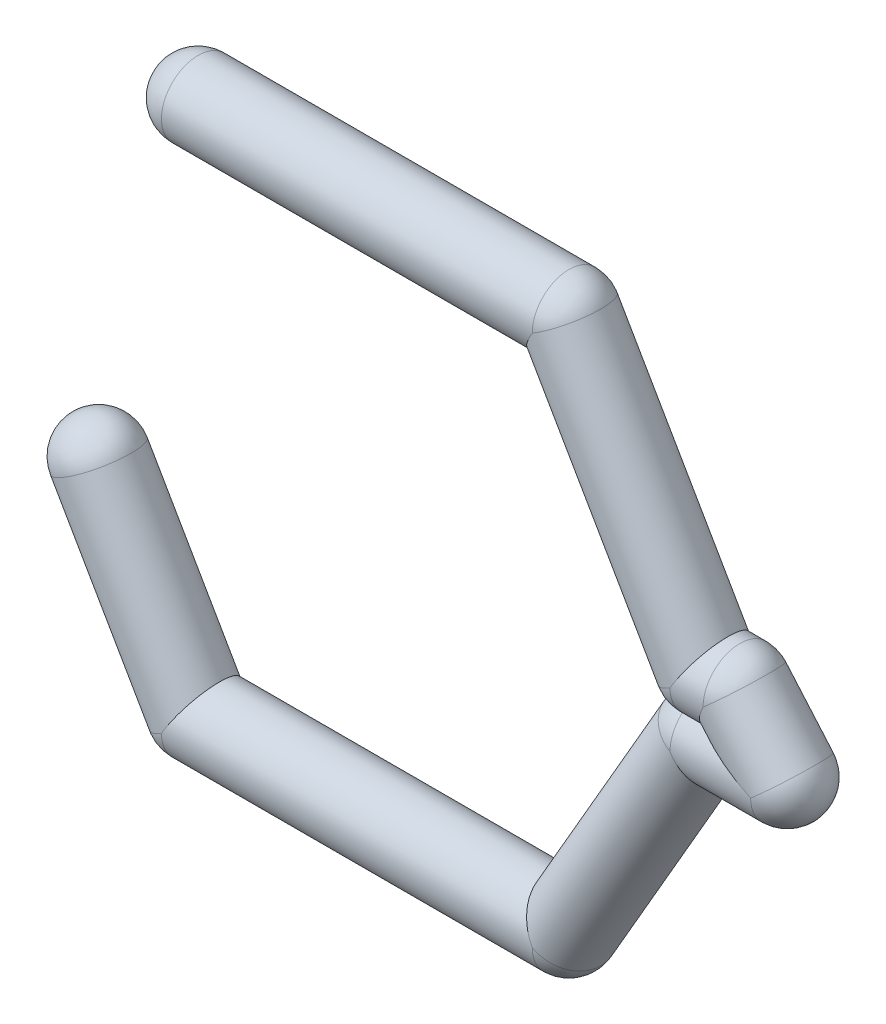
ISO-10303-21;
HEADER;
FILE_DESCRIPTION(('STEP AP214'),'2;1');
FILE_NAME('part.step','',(''),(''),'','','');
FILE_SCHEMA(('AUTOMOTIVE_DESIGN { 1 0 10303 214 1 1 1 1 }'));
ENDSEC;
DATA;
#1=APPLICATION_CONTEXT('core data for automotive mechanical design processes');
#2=APPLICATION_PROTOCOL_DEFINITION('international standard','automotive_design',2000,#1);
#3=PRODUCT_CONTEXT('',#1,'mechanical');
#4=PRODUCT('Part','Part','',(#3));
#5=PRODUCT_RELATED_PRODUCT_CATEGORY('part','',(#4));
#6=PRODUCT_DEFINITION_FORMATION('','',#4);
#7=PRODUCT_DEFINITION_CONTEXT('part definition',#1,'design');
#8=PRODUCT_DEFINITION('design','',#6,#7);
#9=PRODUCT_DEFINITION_SHAPE('','',#8);
#10=(LENGTH_UNIT() NAMED_UNIT(*) SI_UNIT(.MILLI.,.METRE.));
#11=(NAMED_UNIT(*) PLANE_ANGLE_UNIT() SI_UNIT($,.RADIAN.));
#12=(NAMED_UNIT(*) SI_UNIT($,.STERADIAN.) SOLID_ANGLE_UNIT());
#13=UNCERTAINTY_MEASURE_WITH_UNIT(LENGTH_MEASURE(1.E-05),#10,'distance_accuracy_value','');
#14=(GEOMETRIC_REPRESENTATION_CONTEXT(3) GLOBAL_UNCERTAINTY_ASSIGNED_CONTEXT((#13)) GLOBAL_UNIT_ASSIGNED_CONTEXT((#10,
#11,#12)) REPRESENTATION_CONTEXT('',''));
#15=CARTESIAN_POINT('',(0.,0.,0.));
#16=DIRECTION('',(0.,0.,1.));
#17=DIRECTION('',(1.,0.,0.));
#18=AXIS2_PLACEMENT_3D('',#15,#16,#17);
#19=CARTESIAN_POINT('',(-15.164,-4.275,1.425));
#20=DIRECTION('',(1.,0.,0.));
#21=DIRECTION('',(0.,-1.,0.));
#22=AXIS2_PLACEMENT_3D('',#19,#20,#21);
#23=SPHERICAL_SURFACE('',#22,0.24);
#24=CARTESIAN_POINT('',(-15.164,-4.275,1.425));
#25=DIRECTION('',(-0.499700234892811,0.866198404090004,0.));
#26=DIRECTION('',(-0.866198404090004,-0.499700234892811,0.));
#27=AXIS2_PLACEMENT_3D('',#24,#25,#26);
#28=SPHERICAL_SURFACE('',#27,0.24);
#29=CARTESIAN_POINT('',(-15.164,-4.275,1.425));
#30=DIRECTION('',(-0.499700234892811,0.866198404090004,0.));
#31=DIRECTION('',(-0.866198404090004,-0.499700234892811,0.));
#32=AXIS2_PLACEMENT_3D('',#29,#30,#31);
#33=CIRCLE('',#32,0.24);
#34=CARTESIAN_POINT('',(-15.3718876169816,-4.39492805637427,1.425));
#35=VERTEX_POINT('',#34);
#36=EDGE_CURVE('E88',#35,#35,#33,.F.);
#37=ORIENTED_EDGE('',*,*,#36,.F.);
#38=EDGE_LOOP('',(#37));
#39=FACE_BOUND('',#38,.T.);
#40=ADVANCED_FACE('F81',(#39),#28,.T.);
#41=CARTESIAN_POINT('',(-14.515,-5.4,1.425));
#42=DIRECTION('',(-0.499700234892811,0.866198404090004,0.));
#43=DIRECTION('',(-0.866198404090004,-0.499700234892811,0.));
#44=AXIS2_PLACEMENT_3D('',#41,#42,#43);
#45=CYLINDRICAL_SURFACE('',#44,0.24);
#46=CARTESIAN_POINT('',(-14.515,-5.4,1.425));
#47=DIRECTION('',(-0.865938864727993,0.500149860095546,0.));
#48=DIRECTION('',(0.500149860095546,0.865938864727993,0.));
#49=AXIS2_PLACEMENT_3D('',#46,#47,#48);
#50=ELLIPSE('',#49,0.277155824476579,0.24);
#51=CARTESIAN_POINT('',(-14.515,-5.4,1.185));
#52=VERTEX_POINT('',#51);
#53=CARTESIAN_POINT('',(-14.515,-5.4,1.665));
#54=VERTEX_POINT('',#53);
#55=EDGE_CURVE('E12',#52,#54,#50,.F.);
#56=ORIENTED_EDGE('',*,*,#55,.F.);
#57=CARTESIAN_POINT('',(-14.515,-5.4,1.425));
#58=DIRECTION('',(-0.49970023489281,0.866198404090005,0.));
#59=DIRECTION('',(-0.866198404090005,-0.49970023489281,0.));
#60=AXIS2_PLACEMENT_3D('',#57,#58,#59);
#61=CIRCLE('',#60,0.24);
#62=EDGE_CURVE('E94',#52,#54,#61,.T.);
#63=ORIENTED_EDGE('',*,*,#62,.T.);
#64=EDGE_LOOP('',(#56,#63));
#65=FACE_BOUND('',#64,.T.);
#66=ORIENTED_EDGE('',*,*,#36,.T.);
#67=EDGE_LOOP('',(#66));
#68=FACE_BOUND('',#67,.T.);
#69=ADVANCED_FACE('F212',(#65,#68),#45,.T.);
#70=CARTESIAN_POINT('',(-14.515,-5.4,1.425));
#71=DIRECTION('',(1.,0.,0.));
#72=DIRECTION('',(0.,-1.,0.));
#73=AXIS2_PLACEMENT_3D('',#70,#71,#72);
#74=SPHERICAL_SURFACE('',#73,0.24);
#75=ORIENTED_EDGE('',*,*,#62,.F.);
#76=CARTESIAN_POINT('',(-14.515,-5.4,1.425));
#77=DIRECTION('',(-1.,0.,0.));
#78=DIRECTION('',(0.,0.,1.));
#79=AXIS2_PLACEMENT_3D('',#76,#77,#78);
#80=CIRCLE('',#79,0.24);
#81=EDGE_CURVE('E203',#54,#52,#80,.F.);
#82=ORIENTED_EDGE('',*,*,#81,.F.);
#83=EDGE_LOOP('',(#75,#82));
#84=FACE_BOUND('',#83,.T.);
#85=ADVANCED_FACE('F218',(#84),#74,.T.);
#86=CARTESIAN_POINT('',(-12.09,-5.4,1.425));
#87=DIRECTION('',(-1.,0.,0.));
#88=DIRECTION('',(0.,0.,1.));
#89=AXIS2_PLACEMENT_3D('',#86,#87,#88);
#90=CYLINDRICAL_SURFACE('',#89,0.24);
#91=CARTESIAN_POINT('',(-12.09,-5.4,1.425));
#92=DIRECTION('',(-0.866065491045954,-0.499930560397472,0.));
#93=DIRECTION('',(-0.499930560397472,0.866065491045954,0.));
#94=AXIS2_PLACEMENT_3D('',#91,#92,#93);
#95=ELLIPSE('',#94,0.277115301881097,0.24);
#96=CARTESIAN_POINT('',(-12.09,-5.4,1.185));
#97=VERTEX_POINT('',#96);
#98=CARTESIAN_POINT('',(-12.09,-5.4,1.665));
#99=VERTEX_POINT('',#98);
#100=EDGE_CURVE('E206',#97,#99,#95,.F.);
#101=ORIENTED_EDGE('',*,*,#100,.F.);
#102=CARTESIAN_POINT('',(-12.09,-5.4,1.425));
#103=DIRECTION('',(-1.,0.,0.));
#104=DIRECTION('',(0.,0.,1.));
#105=AXIS2_PLACEMENT_3D('',#102,#103,#104);
#106=CIRCLE('',#105,0.24);
#107=EDGE_CURVE('E201',#97,#99,#106,.T.);
#108=ORIENTED_EDGE('',*,*,#107,.T.);
#109=EDGE_LOOP('',(#101,#108));
#110=FACE_BOUND('',#109,.T.);
#111=ORIENTED_EDGE('',*,*,#81,.T.);
#112=ORIENTED_EDGE('',*,*,#55,.T.);
#113=EDGE_LOOP('',(#111,#112));
#114=FACE_BOUND('',#113,.T.);
#115=ADVANCED_FACE('F222',(#110,#114),#90,.T.);
#116=CARTESIAN_POINT('',(-12.09,-5.4,1.425));
#117=DIRECTION('',(1.,0.,0.));
#118=DIRECTION('',(0.,-1.,0.));
#119=AXIS2_PLACEMENT_3D('',#116,#117,#118);
#120=SPHERICAL_SURFACE('',#119,0.24);
#121=ORIENTED_EDGE('',*,*,#107,.F.);
#122=CARTESIAN_POINT('',(-12.09,-5.4,1.425));
#123=DIRECTION('',(-0.500138869561338,-0.865945212559032,0.));
#124=DIRECTION('',(0.865945212559032,-0.500138869561338,0.));
#125=AXIS2_PLACEMENT_3D('',#122,#123,#124);
#126=CIRCLE('',#125,0.24);
#127=EDGE_CURVE('E196',#99,#97,#126,.F.);
#128=ORIENTED_EDGE('',*,*,#127,.F.);
#129=EDGE_LOOP('',(#121,#128));
#130=FACE_BOUND('',#129,.T.);
#131=ADVANCED_FACE('F227',(#130),#120,.T.);
#132=CARTESIAN_POINT('',(-11.189,-3.84,1.425));
#133=DIRECTION('',(-0.500138869561338,-0.865945212559032,0.));
#134=DIRECTION('',(0.865945212559032,-0.500138869561338,0.));
#135=AXIS2_PLACEMENT_3D('',#132,#133,#134);
#136=CYLINDRICAL_SURFACE('',#135,0.240000000000001);
#137=CARTESIAN_POINT('',(-11.189,-3.84,1.425));
#138=DIRECTION('',(-0.866065491045954,-0.499930560397472,0.));
#139=DIRECTION('',(0.499930560397472,-0.866065491045954,0.));
#140=AXIS2_PLACEMENT_3D('',#137,#138,#139);
#141=ELLIPSE('',#140,0.277115301881097,0.24);
#142=CARTESIAN_POINT('',(-11.189,-3.84,1.665));
#143=VERTEX_POINT('',#142);
#144=CARTESIAN_POINT('',(-11.189,-3.84,1.185));
#145=VERTEX_POINT('',#144);
#146=EDGE_CURVE('E199',#143,#145,#141,.F.);
#147=ORIENTED_EDGE('',*,*,#146,.F.);
#148=CARTESIAN_POINT('',(-11.189,-3.84,1.425));
#149=DIRECTION('',(-0.500138869561338,-0.865945212559032,0.));
#150=DIRECTION('',(0.865945212559032,-0.500138869561338,0.));
#151=AXIS2_PLACEMENT_3D('',#148,#149,#150);
#152=CIRCLE('',#151,0.240000000000001);
#153=EDGE_CURVE('E156',#143,#145,#152,.T.);
#154=ORIENTED_EDGE('',*,*,#153,.T.);
#155=EDGE_LOOP('',(#147,#154));
#156=FACE_BOUND('',#155,.T.);
#157=ORIENTED_EDGE('',*,*,#127,.T.);
#158=ORIENTED_EDGE('',*,*,#100,.T.);
#159=EDGE_LOOP('',(#157,#158));
#160=FACE_BOUND('',#159,.T.);
#161=ADVANCED_FACE('F231',(#156,#160),#136,.T.);
#162=CARTESIAN_POINT('',(-11.189,-3.84,1.425));
#163=DIRECTION('',(1.,0.,0.));
#164=DIRECTION('',(0.,-1.,0.));
#165=AXIS2_PLACEMENT_3D('',#162,#163,#164);
#166=SPHERICAL_SURFACE('',#165,0.24);
#167=ORIENTED_EDGE('',*,*,#153,.F.);
#168=CARTESIAN_POINT('',(-11.189,-3.84,1.425));
#169=DIRECTION('',(-1.,0.,0.));
#170=DIRECTION('',(0.,0.,1.));
#171=AXIS2_PLACEMENT_3D('',#168,#169,#170);
#172=CIRCLE('',#171,0.24);
#173=CARTESIAN_POINT('',(-11.189,-3.66,1.58374507866388));
#174=VERTEX_POINT('',#173);
#175=EDGE_CURVE('E149',#143,#174,#172,.T.);
#176=ORIENTED_EDGE('',*,*,#175,.T.);
#177=CARTESIAN_POINT('',(-11.189,-3.66,1.425));
#178=DIRECTION('',(0.,-1.,0.));
#179=DIRECTION('',(0.,0.,-1.));
#180=AXIS2_PLACEMENT_3D('',#177,#178,#179);
#181=CIRCLE('',#180,0.158745078663876);
#182=CARTESIAN_POINT('',(-11.189,-3.66,1.26625492133612));
#183=VERTEX_POINT('',#182);
#184=EDGE_CURVE('E154',#174,#183,#181,.T.);
#185=ORIENTED_EDGE('',*,*,#184,.T.);
#186=EDGE_CURVE('E160',#183,#145,#172,.T.);
#187=ORIENTED_EDGE('',*,*,#186,.T.);
#188=EDGE_LOOP('',(#167,#176,#185,#187));
#189=FACE_BOUND('',#188,.T.);
#190=ADVANCED_FACE('F151',(#189),#166,.T.);
#191=CARTESIAN_POINT('',(-10.662,-3.84,1.425));
#192=DIRECTION('',(1.,0.,0.));
#193=DIRECTION('',(0.,-1.,0.));
#194=AXIS2_PLACEMENT_3D('',#191,#192,#193);
#195=SPHERICAL_SURFACE('',#194,0.24);
#196=CARTESIAN_POINT('',(-10.662,-3.84,1.425));
#197=DIRECTION('',(0.653729317990233,-0.756728470985481,0.));
#198=DIRECTION('',(0.756728470985481,0.653729317990233,0.));
#199=AXIS2_PLACEMENT_3D('',#196,#197,#198);
#200=CIRCLE('',#199,0.24);
#201=CARTESIAN_POINT('',(-10.662,-3.84000000000001,1.665));
#202=VERTEX_POINT('',#201);
#203=CARTESIAN_POINT('',(-10.662,-3.84000000000001,1.185));
#204=VERTEX_POINT('',#203);
#205=EDGE_CURVE('E388',#202,#204,#200,.F.);
#206=ORIENTED_EDGE('',*,*,#205,.F.);
#207=CARTESIAN_POINT('',(-10.662,-3.84,1.425));
#208=DIRECTION('',(-1.,0.,0.));
#209=DIRECTION('',(0.,0.,1.));
#210=AXIS2_PLACEMENT_3D('',#207,#208,#209);
#211=CIRCLE('',#210,0.24);
#212=EDGE_CURVE('E161',#204,#202,#211,.T.);
#213=ORIENTED_EDGE('',*,*,#212,.F.);
#214=EDGE_LOOP('',(#206,#213));
#215=FACE_BOUND('',#214,.T.);
#216=ADVANCED_FACE('F236',(#215),#195,.T.);
#217=CARTESIAN_POINT('',(-10.973,-3.48,1.425));
#218=DIRECTION('',(0.653729317990233,-0.756728470985481,0.));
#219=DIRECTION('',(0.756728470985481,0.653729317990233,0.));
#220=AXIS2_PLACEMENT_3D('',#217,#218,#219);
#221=CYLINDRICAL_SURFACE('',#220,0.240000000000001);
#222=CARTESIAN_POINT('',(-10.662,-3.84,1.425));
#223=DIRECTION('',(-0.416095350857088,-0.909320987877832,0.));
#224=DIRECTION('',(0.909320987877832,-0.416095350857088,0.));
#225=AXIS2_PLACEMENT_3D('',#222,#223,#224);
#226=ELLIPSE('',#225,0.576790871384743,0.24);
#227=CARTESIAN_POINT('',(-11.0553660337249,-3.66,1.58374507866388));
#228=VERTEX_POINT('',#227);
#229=EDGE_CURVE('E184',#202,#228,#226,.T.);
#230=ORIENTED_EDGE('',*,*,#229,.F.);
#231=ORIENTED_EDGE('',*,*,#205,.T.);
#232=CARTESIAN_POINT('',(-11.0553660337249,-3.66,1.26625492133612));
#233=VERTEX_POINT('',#232);
#234=EDGE_CURVE('E394',#233,#204,#226,.T.);
#235=ORIENTED_EDGE('',*,*,#234,.F.);
#236=CARTESIAN_POINT('',(-10.973,-3.48,1.425));
#237=DIRECTION('',(0.909320987877832,-0.416095350857088,0.));
#238=DIRECTION('',(-0.416095350857088,-0.909320987877832,0.));
#239=AXIS2_PLACEMENT_3D('',#236,#237,#238);
#240=ELLIPSE('',#239,0.263933202025954,0.24);
#241=CARTESIAN_POINT('',(-10.973,-3.48,1.185));
#242=VERTEX_POINT('',#241);
#243=EDGE_CURVE('E186',#242,#233,#240,.F.);
#244=ORIENTED_EDGE('',*,*,#243,.F.);
#245=CARTESIAN_POINT('',(-10.973,-3.48,1.425));
#246=DIRECTION('',(0.65372931799024,-0.756728470985475,0.));
#247=DIRECTION('',(0.756728470985475,0.65372931799024,0.));
#248=AXIS2_PLACEMENT_3D('',#245,#246,#247);
#249=CIRCLE('',#248,0.240000000000001);
#250=CARTESIAN_POINT('',(-10.973,-3.48,1.665));
#251=VERTEX_POINT('',#250);
#252=EDGE_CURVE('E383',#242,#251,#249,.T.);
#253=ORIENTED_EDGE('',*,*,#252,.T.);
#254=EDGE_CURVE('E191',#228,#251,#240,.F.);
#255=ORIENTED_EDGE('',*,*,#254,.F.);
#256=EDGE_LOOP('',(#230,#231,#235,#244,#253,#255));
#257=FACE_BOUND('',#256,.T.);
#258=ADVANCED_FACE('F239',(#257),#221,.T.);
#259=CARTESIAN_POINT('',(-10.973,-3.48,1.425));
#260=DIRECTION('',(1.,0.,0.));
#261=DIRECTION('',(0.,-1.,0.));
#262=AXIS2_PLACEMENT_3D('',#259,#260,#261);
#263=SPHERICAL_SURFACE('',#262,0.24);
#264=ORIENTED_EDGE('',*,*,#252,.F.);
#265=CARTESIAN_POINT('',(-10.973,-3.48,1.425));
#266=DIRECTION('',(1.,0.,0.));
#267=DIRECTION('',(0.,0.,-1.));
#268=AXIS2_PLACEMENT_3D('',#265,#266,#267);
#269=CIRCLE('',#268,0.24);
#270=EDGE_CURVE('E380',#251,#242,#269,.F.);
#271=ORIENTED_EDGE('',*,*,#270,.F.);
#272=EDGE_LOOP('',(#264,#271));
#273=FACE_BOUND('',#272,.T.);
#274=ADVANCED_FACE('F243',(#273),#263,.T.);
#275=CARTESIAN_POINT('',(-11.189,-3.48,1.425));
#276=DIRECTION('',(1.,0.,0.));
#277=DIRECTION('',(0.,-1.,0.));
#278=AXIS2_PLACEMENT_3D('',#275,#276,#277);
#279=SPHERICAL_SURFACE('',#278,0.24);
#280=CARTESIAN_POINT('',(-11.189,-3.48,1.425));
#281=DIRECTION('',(0.500138869561339,-0.865945212559032,0.));
#282=DIRECTION('',(0.865945212559032,0.500138869561339,0.));
#283=AXIS2_PLACEMENT_3D('',#280,#281,#282);
#284=CIRCLE('',#283,0.24);
#285=CARTESIAN_POINT('',(-11.189,-3.48,1.185));
#286=VERTEX_POINT('',#285);
#287=CARTESIAN_POINT('',(-11.189,-3.48,1.665));
#288=VERTEX_POINT('',#287);
#289=EDGE_CURVE('E374',#286,#288,#284,.F.);
#290=ORIENTED_EDGE('',*,*,#289,.F.);
#291=CARTESIAN_POINT('',(-11.189,-3.48,1.425));
#292=DIRECTION('',(1.,0.,0.));
#293=DIRECTION('',(0.,0.,-1.));
#294=AXIS2_PLACEMENT_3D('',#291,#292,#293);
#295=CIRCLE('',#294,0.24);
#296=EDGE_CURVE('E175',#183,#286,#295,.T.);
#297=ORIENTED_EDGE('',*,*,#296,.F.);
#298=ORIENTED_EDGE('',*,*,#184,.F.);
#299=EDGE_CURVE('E165',#288,#174,#295,.T.);
#300=ORIENTED_EDGE('',*,*,#299,.F.);
#301=EDGE_LOOP('',(#290,#297,#298,#300));
#302=FACE_BOUND('',#301,.T.);
#303=ADVANCED_FACE('F177',(#302),#279,.T.);
#304=CARTESIAN_POINT('',(-12.09,-1.92,1.425));
#305=DIRECTION('',(0.500138869561339,-0.865945212559032,0.));
#306=DIRECTION('',(0.865945212559032,0.500138869561339,0.));
#307=AXIS2_PLACEMENT_3D('',#304,#305,#306);
#308=CYLINDRICAL_SURFACE('',#307,0.240000000000001);
#309=CARTESIAN_POINT('',(-11.189,-3.48,1.425));
#310=DIRECTION('',(0.866065491045954,-0.499930560397472,0.));
#311=DIRECTION('',(-0.499930560397472,-0.866065491045954,0.));
#312=AXIS2_PLACEMENT_3D('',#309,#310,#311);
#313=ELLIPSE('',#312,0.277115301881097,0.24);
#314=EDGE_CURVE('E171',#286,#288,#313,.T.);
#315=ORIENTED_EDGE('',*,*,#314,.F.);
#316=ORIENTED_EDGE('',*,*,#289,.T.);
#317=EDGE_LOOP('',(#315,#316));
#318=FACE_BOUND('',#317,.T.);
#319=CARTESIAN_POINT('',(-12.09,-1.92,1.425));
#320=DIRECTION('',(0.866065491045954,-0.499930560397472,0.));
#321=DIRECTION('',(-0.499930560397472,-0.866065491045954,0.));
#322=AXIS2_PLACEMENT_3D('',#319,#320,#321);
#323=ELLIPSE('',#322,0.277115301881097,0.24);
#324=CARTESIAN_POINT('',(-12.09,-1.92,1.185));
#325=VERTEX_POINT('',#324);
#326=CARTESIAN_POINT('',(-12.09,-1.92,1.665));
#327=VERTEX_POINT('',#326);
#328=EDGE_CURVE('E377',#325,#327,#323,.F.);
#329=ORIENTED_EDGE('',*,*,#328,.F.);
#330=CARTESIAN_POINT('',(-12.09,-1.92,1.425));
#331=DIRECTION('',(0.500138869561338,-0.865945212559032,0.));
#332=DIRECTION('',(0.865945212559032,0.500138869561338,0.));
#333=AXIS2_PLACEMENT_3D('',#330,#331,#332);
#334=CIRCLE('',#333,0.240000000000001);
#335=EDGE_CURVE('E178',#325,#327,#334,.T.);
#336=ORIENTED_EDGE('',*,*,#335,.T.);
#337=EDGE_LOOP('',(#329,#336));
#338=FACE_BOUND('',#337,.T.);
#339=ADVANCED_FACE('F247',(#318,#338),#308,.T.);
#340=CARTESIAN_POINT('',(-12.09,-1.92,1.425));
#341=DIRECTION('',(1.,0.,0.));
#342=DIRECTION('',(0.,-1.,0.));
#343=AXIS2_PLACEMENT_3D('',#340,#341,#342);
#344=SPHERICAL_SURFACE('',#343,0.24);
#345=ORIENTED_EDGE('',*,*,#335,.F.);
#346=CARTESIAN_POINT('',(-12.09,-1.92,1.425));
#347=DIRECTION('',(1.,0.,0.));
#348=DIRECTION('',(0.,0.,-1.));
#349=AXIS2_PLACEMENT_3D('',#346,#347,#348);
#350=CIRCLE('',#349,0.24);
#351=EDGE_CURVE('E179',#325,#327,#350,.T.);
#352=ORIENTED_EDGE('',*,*,#351,.T.);
#353=EDGE_LOOP('',(#345,#352));
#354=FACE_BOUND('',#353,.T.);
#355=ADVANCED_FACE('F250',(#354),#344,.T.);
#356=CARTESIAN_POINT('',(-14.515,-1.92,1.425));
#357=DIRECTION('',(1.,0.,0.));
#358=DIRECTION('',(0.,0.,-1.));
#359=AXIS2_PLACEMENT_3D('',#356,#357,#358);
#360=CYLINDRICAL_SURFACE('',#359,0.24);
#361=ORIENTED_EDGE('',*,*,#351,.F.);
#362=ORIENTED_EDGE('',*,*,#328,.T.);
#363=EDGE_LOOP('',(#361,#362));
#364=FACE_BOUND('',#363,.T.);
#365=CARTESIAN_POINT('',(-14.515,-1.92,1.425));
#366=DIRECTION('',(1.,0.,0.));
#367=DIRECTION('',(0.,0.,-1.));
#368=AXIS2_PLACEMENT_3D('',#365,#366,#367);
#369=CIRCLE('',#368,0.24);
#370=CARTESIAN_POINT('',(-14.515,-1.92,1.185));
#371=VERTEX_POINT('',#370);
#372=EDGE_CURVE('E378',#371,#371,#369,.T.);
#373=ORIENTED_EDGE('',*,*,#372,.T.);
#374=EDGE_LOOP('',(#373));
#375=FACE_BOUND('',#374,.T.);
#376=ADVANCED_FACE('F260',(#364,#375),#360,.T.);
#377=CARTESIAN_POINT('',(-14.515,-1.92,1.425));
#378=DIRECTION('',(1.,0.,0.));
#379=DIRECTION('',(0.,-1.,0.));
#380=AXIS2_PLACEMENT_3D('',#377,#378,#379);
#381=SPHERICAL_SURFACE('',#380,0.24);
#382=ORIENTED_EDGE('',*,*,#372,.F.);
#383=EDGE_LOOP('',(#382));
#384=FACE_BOUND('',#383,.T.);
#385=ADVANCED_FACE('F257',(#384),#381,.T.);
#386=CARTESIAN_POINT('',(-11.189,-3.48,1.425));
#387=DIRECTION('',(1.,0.,0.));
#388=DIRECTION('',(0.,0.,-1.));
#389=AXIS2_PLACEMENT_3D('',#386,#387,#388);
#390=CYLINDRICAL_SURFACE('',#389,0.24);
#391=DIRECTION('',(-1.,0.,0.));
#392=VECTOR('',#391,1.);
#393=CARTESIAN_POINT('',(-10.9255,-3.66,1.26625492133612));
#394=LINE('',#393,#392);
#395=EDGE_CURVE('E185',#183,#233,#394,.F.);
#396=ORIENTED_EDGE('',*,*,#395,.F.);
#397=ORIENTED_EDGE('',*,*,#296,.T.);
#398=ORIENTED_EDGE('',*,*,#314,.T.);
#399=ORIENTED_EDGE('',*,*,#299,.T.);
#400=DIRECTION('',(-1.,0.,0.));
#401=VECTOR('',#400,1.);
#402=CARTESIAN_POINT('',(-10.9255,-3.66,1.58374507866388));
#403=LINE('',#402,#401);
#404=EDGE_CURVE('E168',#228,#174,#403,.T.);
#405=ORIENTED_EDGE('',*,*,#404,.F.);
#406=ORIENTED_EDGE('',*,*,#254,.T.);
#407=ORIENTED_EDGE('',*,*,#270,.T.);
#408=ORIENTED_EDGE('',*,*,#243,.T.);
#409=EDGE_LOOP('',(#396,#397,#398,#399,#405,#406,#407,#408));
#410=FACE_BOUND('',#409,.T.);
#411=ADVANCED_FACE('F167',(#410),#390,.T.);
#412=CARTESIAN_POINT('',(-10.662,-3.84,1.425));
#413=DIRECTION('',(-1.,0.,0.));
#414=DIRECTION('',(0.,0.,1.));
#415=AXIS2_PLACEMENT_3D('',#412,#413,#414);
#416=CYLINDRICAL_SURFACE('',#415,0.24);
#417=ORIENTED_EDGE('',*,*,#175,.F.);
#418=ORIENTED_EDGE('',*,*,#146,.T.);
#419=ORIENTED_EDGE('',*,*,#186,.F.);
#420=ORIENTED_EDGE('',*,*,#395,.T.);
#421=ORIENTED_EDGE('',*,*,#234,.T.);
#422=ORIENTED_EDGE('',*,*,#212,.T.);
#423=ORIENTED_EDGE('',*,*,#229,.T.);
#424=ORIENTED_EDGE('',*,*,#404,.T.);
#425=EDGE_LOOP('',(#417,#418,#419,#420,#421,#422,#423,#424));
#426=FACE_BOUND('',#425,.T.);
#427=ADVANCED_FACE('F182',(#426),#416,.T.);
#428=CLOSED_SHELL('',(#40,#69,#85,#115,#131,#161,#190,#216,#258,#274,#303,#339,#355,#376,#385,
#411,#427));
#429=MANIFOLD_SOLID_BREP('B2',#428);
#430=ADVANCED_BREP_SHAPE_REPRESENTATION('',(#18,#429),#14);
#431=SHAPE_DEFINITION_REPRESENTATION(#9,#430);
ENDSEC;
END-ISO-10303-21;
